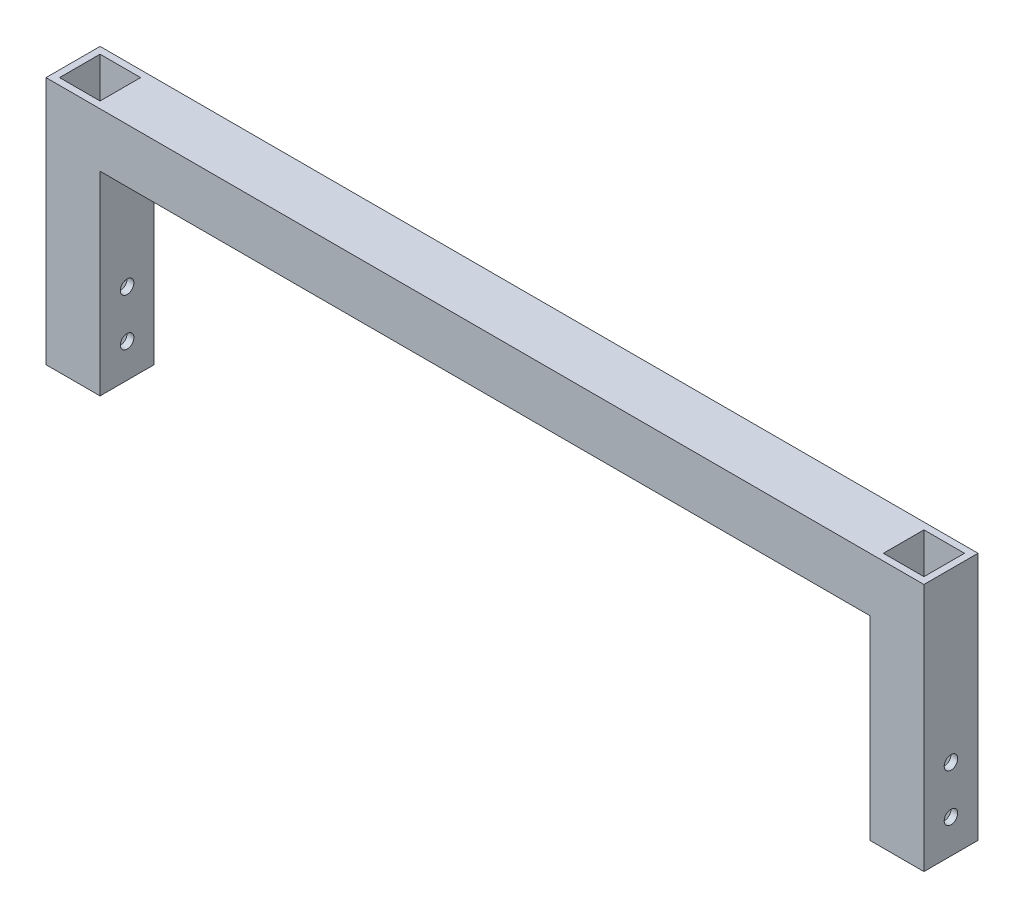
ISO-10303-21;
HEADER;
FILE_DESCRIPTION(('STEP AP214'),'2;1');
FILE_NAME('part.step','',(''),(''),'','','');
FILE_SCHEMA(('AUTOMOTIVE_DESIGN { 1 0 10303 214 1 1 1 1 }'));
ENDSEC;
DATA;
#1=APPLICATION_CONTEXT('core data for automotive mechanical design processes');
#2=APPLICATION_PROTOCOL_DEFINITION('international standard','automotive_design',2000,#1);
#3=PRODUCT_CONTEXT('',#1,'mechanical');
#4=PRODUCT('Part','Part','',(#3));
#5=PRODUCT_RELATED_PRODUCT_CATEGORY('part','',(#4));
#6=PRODUCT_DEFINITION_FORMATION('','',#4);
#7=PRODUCT_DEFINITION_CONTEXT('part definition',#1,'design');
#8=PRODUCT_DEFINITION('design','',#6,#7);
#9=PRODUCT_DEFINITION_SHAPE('','',#8);
#10=(LENGTH_UNIT() NAMED_UNIT(*) SI_UNIT(.MILLI.,.METRE.));
#11=(NAMED_UNIT(*) PLANE_ANGLE_UNIT() SI_UNIT($,.RADIAN.));
#12=(NAMED_UNIT(*) SI_UNIT($,.STERADIAN.) SOLID_ANGLE_UNIT());
#13=UNCERTAINTY_MEASURE_WITH_UNIT(LENGTH_MEASURE(1.E-05),#10,'distance_accuracy_value','');
#14=(GEOMETRIC_REPRESENTATION_CONTEXT(3) GLOBAL_UNCERTAINTY_ASSIGNED_CONTEXT((#13)) GLOBAL_UNIT_ASSIGNED_CONTEXT((#10,
#11,#12)) REPRESENTATION_CONTEXT('',''));
#15=CARTESIAN_POINT('',(0.,0.,0.));
#16=DIRECTION('',(0.,0.,1.));
#17=DIRECTION('',(1.,0.,0.));
#18=AXIS2_PLACEMENT_3D('',#15,#16,#17);
#19=CARTESIAN_POINT('',(22.225,116.84,3.175));
#20=DIRECTION('',(-1.,0.,0.));
#21=DIRECTION('',(0.,0.,1.));
#22=AXIS2_PLACEMENT_3D('',#19,#20,#21);
#23=PLANE('',#22);
#24=CARTESIAN_POINT('',(22.225,38.1,-9.525));
#25=DIRECTION('',(-1.,0.,0.));
#26=DIRECTION('',(0.,0.,1.));
#27=AXIS2_PLACEMENT_3D('',#24,#25,#26);
#28=CIRCLE('',#27,3.175);
#29=CARTESIAN_POINT('',(22.225,38.1,-6.35));
#30=VERTEX_POINT('',#29);
#31=EDGE_CURVE('E281',#30,#30,#28,.T.);
#32=ORIENTED_EDGE('',*,*,#31,.T.);
#33=EDGE_LOOP('',(#32));
#34=FACE_BOUND('',#33,.T.);
#35=CARTESIAN_POINT('',(22.225,15.875,-9.525));
#36=DIRECTION('',(-1.,0.,0.));
#37=DIRECTION('',(0.,0.,1.));
#38=AXIS2_PLACEMENT_3D('',#35,#36,#37);
#39=CIRCLE('',#38,3.175);
#40=CARTESIAN_POINT('',(22.225,15.875,-6.35));
#41=VERTEX_POINT('',#40);
#42=EDGE_CURVE('E309',#41,#41,#39,.T.);
#43=ORIENTED_EDGE('',*,*,#42,.T.);
#44=EDGE_LOOP('',(#43));
#45=FACE_BOUND('',#44,.T.);
#46=DIRECTION('',(0.,0.,-1.));
#47=VECTOR('',#46,1.);
#48=CARTESIAN_POINT('',(22.225,91.44,3.175));
#49=LINE('',#48,#47);
#50=CARTESIAN_POINT('',(22.225,91.44,3.175));
#51=VERTEX_POINT('',#50);
#52=CARTESIAN_POINT('',(22.225,91.44,-22.225));
#53=VERTEX_POINT('',#52);
#54=EDGE_CURVE('E61',#51,#53,#49,.T.);
#55=ORIENTED_EDGE('',*,*,#54,.F.);
#56=DIRECTION('',(0.,-1.,0.));
#57=VECTOR('',#56,1.);
#58=CARTESIAN_POINT('',(22.225,116.84,3.175));
#59=LINE('',#58,#57);
#60=CARTESIAN_POINT('',(22.225,0.,3.175));
#61=VERTEX_POINT('',#60);
#62=EDGE_CURVE('E45',#51,#61,#59,.T.);
#63=ORIENTED_EDGE('',*,*,#62,.T.);
#64=DIRECTION('',(0.,0.,-1.));
#65=VECTOR('',#64,1.);
#66=CARTESIAN_POINT('',(22.225,0.,3.175));
#67=LINE('',#66,#65);
#68=CARTESIAN_POINT('',(22.225,0.,-22.225));
#69=VERTEX_POINT('',#68);
#70=EDGE_CURVE('E364',#61,#69,#67,.T.);
#71=ORIENTED_EDGE('',*,*,#70,.T.);
#72=DIRECTION('',(0.,-1.,0.));
#73=VECTOR('',#72,1.);
#74=CARTESIAN_POINT('',(22.225,116.84,-22.225));
#75=LINE('',#74,#73);
#76=EDGE_CURVE('E370',#53,#69,#75,.T.);
#77=ORIENTED_EDGE('',*,*,#76,.F.);
#78=EDGE_LOOP('',(#55,#63,#71,#77));
#79=FACE_BOUND('',#78,.T.);
#80=ADVANCED_FACE('F34',(#34,#45,#79),#23,.F.);
#81=CARTESIAN_POINT('',(0.,116.84,0.));
#82=DIRECTION('',(0.,-1.,0.));
#83=DIRECTION('',(0.,0.,-1.));
#84=AXIS2_PLACEMENT_3D('',#81,#82,#83);
#85=PLANE('',#84);
#86=DIRECTION('',(0.,0.,1.));
#87=VECTOR('',#86,1.);
#88=CARTESIAN_POINT('',(-3.175,116.84,3.175));
#89=LINE('',#88,#87);
#90=CARTESIAN_POINT('',(-3.175,116.84,-22.225));
#91=VERTEX_POINT('',#90);
#92=CARTESIAN_POINT('',(-3.175,116.84,3.175));
#93=VERTEX_POINT('',#92);
#94=EDGE_CURVE('E350',#91,#93,#89,.T.);
#95=ORIENTED_EDGE('',*,*,#94,.T.);
#96=DIRECTION('',(1.,0.,0.));
#97=VECTOR('',#96,1.);
#98=CARTESIAN_POINT('',(-3.175,116.84,3.175));
#99=LINE('',#98,#97);
#100=CARTESIAN_POINT('',(409.321,116.84,3.175));
#101=VERTEX_POINT('',#100);
#102=EDGE_CURVE('E353',#93,#101,#99,.T.);
#103=ORIENTED_EDGE('',*,*,#102,.T.);
#104=DIRECTION('',(0.,0.,1.));
#105=VECTOR('',#104,1.);
#106=CARTESIAN_POINT('',(409.321,116.84,3.175));
#107=LINE('',#106,#105);
#108=CARTESIAN_POINT('',(409.321,116.84,-22.225));
#109=VERTEX_POINT('',#108);
#110=EDGE_CURVE('E221',#109,#101,#107,.T.);
#111=ORIENTED_EDGE('',*,*,#110,.F.);
#112=DIRECTION('',(-1.,0.,0.));
#113=VECTOR('',#112,1.);
#114=CARTESIAN_POINT('',(-3.175,116.84,-22.225));
#115=LINE('',#114,#113);
#116=EDGE_CURVE('E356',#109,#91,#115,.T.);
#117=ORIENTED_EDGE('',*,*,#116,.T.);
#118=EDGE_LOOP('',(#95,#103,#111,#117));
#119=FACE_BOUND('',#118,.T.);
#120=DIRECTION('',(0.,0.,1.));
#121=VECTOR('',#120,1.);
#122=CARTESIAN_POINT('',(0.,116.84,0.));
#123=LINE('',#122,#121);
#124=CARTESIAN_POINT('',(0.,116.84,-19.05));
#125=VERTEX_POINT('',#124);
#126=CARTESIAN_POINT('',(0.,116.84,0.));
#127=VERTEX_POINT('',#126);
#128=EDGE_CURVE('E319',#125,#127,#123,.T.);
#129=ORIENTED_EDGE('',*,*,#128,.F.);
#130=DIRECTION('',(-1.,0.,0.));
#131=VECTOR('',#130,1.);
#132=CARTESIAN_POINT('',(0.,116.84,-19.05));
#133=LINE('',#132,#131);
#134=CARTESIAN_POINT('',(19.05,116.84,-19.05));
#135=VERTEX_POINT('',#134);
#136=EDGE_CURVE('E327',#135,#125,#133,.T.);
#137=ORIENTED_EDGE('',*,*,#136,.F.);
#138=DIRECTION('',(0.,0.,-1.));
#139=VECTOR('',#138,1.);
#140=CARTESIAN_POINT('',(19.05,116.84,0.));
#141=LINE('',#140,#139);
#142=CARTESIAN_POINT('',(19.05,116.84,0.));
#143=VERTEX_POINT('',#142);
#144=EDGE_CURVE('E324',#143,#135,#141,.T.);
#145=ORIENTED_EDGE('',*,*,#144,.F.);
#146=DIRECTION('',(1.,0.,0.));
#147=VECTOR('',#146,1.);
#148=CARTESIAN_POINT('',(0.,116.84,0.));
#149=LINE('',#148,#147);
#150=EDGE_CURVE('E321',#127,#143,#149,.T.);
#151=ORIENTED_EDGE('',*,*,#150,.F.);
#152=EDGE_LOOP('',(#129,#137,#145,#151));
#153=FACE_BOUND('',#152,.T.);
#154=DIRECTION('',(1.,0.,0.));
#155=VECTOR('',#154,1.);
#156=CARTESIAN_POINT('',(406.146,116.84,-19.05));
#157=LINE('',#156,#155);
#158=CARTESIAN_POINT('',(387.096,116.84,-19.05));
#159=VERTEX_POINT('',#158);
#160=CARTESIAN_POINT('',(406.146,116.84,-19.05));
#161=VERTEX_POINT('',#160);
#162=EDGE_CURVE('E181',#159,#161,#157,.T.);
#163=ORIENTED_EDGE('',*,*,#162,.T.);
#164=DIRECTION('',(0.,0.,1.));
#165=VECTOR('',#164,1.);
#166=CARTESIAN_POINT('',(406.146,116.84,0.));
#167=LINE('',#166,#165);
#168=CARTESIAN_POINT('',(406.146,116.84,0.));
#169=VERTEX_POINT('',#168);
#170=EDGE_CURVE('E191',#161,#169,#167,.T.);
#171=ORIENTED_EDGE('',*,*,#170,.T.);
#172=DIRECTION('',(-1.,0.,0.));
#173=VECTOR('',#172,1.);
#174=CARTESIAN_POINT('',(406.146,116.84,0.));
#175=LINE('',#174,#173);
#176=CARTESIAN_POINT('',(387.096,116.84,0.));
#177=VERTEX_POINT('',#176);
#178=EDGE_CURVE('E203',#169,#177,#175,.T.);
#179=ORIENTED_EDGE('',*,*,#178,.T.);
#180=DIRECTION('',(0.,0.,-1.));
#181=VECTOR('',#180,1.);
#182=CARTESIAN_POINT('',(387.096,116.84,0.));
#183=LINE('',#182,#181);
#184=EDGE_CURVE('E201',#177,#159,#183,.T.);
#185=ORIENTED_EDGE('',*,*,#184,.T.);
#186=EDGE_LOOP('',(#163,#171,#179,#185));
#187=FACE_BOUND('',#186,.T.);
#188=ADVANCED_FACE('F200',(#119,#153,#187),#85,.F.);
#189=CARTESIAN_POINT('',(0.,0.,0.));
#190=DIRECTION('',(0.,-1.,0.));
#191=DIRECTION('',(0.,0.,-1.));
#192=AXIS2_PLACEMENT_3D('',#189,#190,#191);
#193=PLANE('',#192);
#194=DIRECTION('',(0.,0.,1.));
#195=VECTOR('',#194,1.);
#196=CARTESIAN_POINT('',(-3.175,0.,3.175));
#197=LINE('',#196,#195);
#198=CARTESIAN_POINT('',(-3.175,0.,-22.225));
#199=VERTEX_POINT('',#198);
#200=CARTESIAN_POINT('',(-3.175,0.,3.175));
#201=VERTEX_POINT('',#200);
#202=EDGE_CURVE('E349',#199,#201,#197,.T.);
#203=ORIENTED_EDGE('',*,*,#202,.F.);
#204=DIRECTION('',(-1.,0.,0.));
#205=VECTOR('',#204,1.);
#206=CARTESIAN_POINT('',(-3.175,0.,-22.225));
#207=LINE('',#206,#205);
#208=EDGE_CURVE('E354',#69,#199,#207,.T.);
#209=ORIENTED_EDGE('',*,*,#208,.F.);
#210=ORIENTED_EDGE('',*,*,#70,.F.);
#211=DIRECTION('',(1.,0.,0.));
#212=VECTOR('',#211,1.);
#213=CARTESIAN_POINT('',(-3.175,0.,3.175));
#214=LINE('',#213,#212);
#215=EDGE_CURVE('E361',#201,#61,#214,.T.);
#216=ORIENTED_EDGE('',*,*,#215,.F.);
#217=EDGE_LOOP('',(#203,#209,#210,#216));
#218=FACE_BOUND('',#217,.T.);
#219=DIRECTION('',(-1.,0.,0.));
#220=VECTOR('',#219,1.);
#221=CARTESIAN_POINT('',(0.,0.,-19.05));
#222=LINE('',#221,#220);
#223=CARTESIAN_POINT('',(19.05,0.,-19.05));
#224=VERTEX_POINT('',#223);
#225=CARTESIAN_POINT('',(0.,0.,-19.05));
#226=VERTEX_POINT('',#225);
#227=EDGE_CURVE('E322',#224,#226,#222,.T.);
#228=ORIENTED_EDGE('',*,*,#227,.T.);
#229=DIRECTION('',(0.,0.,1.));
#230=VECTOR('',#229,1.);
#231=CARTESIAN_POINT('',(0.,0.,0.));
#232=LINE('',#231,#230);
#233=CARTESIAN_POINT('',(0.,0.,0.));
#234=VERTEX_POINT('',#233);
#235=EDGE_CURVE('E318',#226,#234,#232,.T.);
#236=ORIENTED_EDGE('',*,*,#235,.T.);
#237=DIRECTION('',(1.,0.,0.));
#238=VECTOR('',#237,1.);
#239=CARTESIAN_POINT('',(0.,0.,0.));
#240=LINE('',#239,#238);
#241=CARTESIAN_POINT('',(19.05,0.,0.));
#242=VERTEX_POINT('',#241);
#243=EDGE_CURVE('E332',#234,#242,#240,.T.);
#244=ORIENTED_EDGE('',*,*,#243,.T.);
#245=DIRECTION('',(0.,0.,-1.));
#246=VECTOR('',#245,1.);
#247=CARTESIAN_POINT('',(19.05,0.,0.));
#248=LINE('',#247,#246);
#249=EDGE_CURVE('E335',#242,#224,#248,.T.);
#250=ORIENTED_EDGE('',*,*,#249,.T.);
#251=EDGE_LOOP('',(#228,#236,#244,#250));
#252=FACE_BOUND('',#251,.T.);
#253=ADVANCED_FACE('F394',(#218,#252),#193,.T.);
#254=CARTESIAN_POINT('',(-3.175,116.84,3.175));
#255=DIRECTION('',(1.,0.,0.));
#256=DIRECTION('',(0.,0.,-1.));
#257=AXIS2_PLACEMENT_3D('',#254,#255,#256);
#258=PLANE('',#257);
#259=CARTESIAN_POINT('',(-3.175,38.1,-9.525));
#260=DIRECTION('',(-1.,0.,0.));
#261=DIRECTION('',(0.,0.,1.));
#262=AXIS2_PLACEMENT_3D('',#259,#260,#261);
#263=CIRCLE('',#262,3.175);
#264=CARTESIAN_POINT('',(-3.175,38.1,-6.35));
#265=VERTEX_POINT('',#264);
#266=EDGE_CURVE('E295',#265,#265,#263,.T.);
#267=ORIENTED_EDGE('',*,*,#266,.F.);
#268=EDGE_LOOP('',(#267));
#269=FACE_BOUND('',#268,.T.);
#270=CARTESIAN_POINT('',(-3.175,15.875,-9.525));
#271=DIRECTION('',(-1.,0.,0.));
#272=DIRECTION('',(0.,0.,1.));
#273=AXIS2_PLACEMENT_3D('',#270,#271,#272);
#274=CIRCLE('',#273,3.175);
#275=CARTESIAN_POINT('',(-3.175,15.875,-6.35));
#276=VERTEX_POINT('',#275);
#277=EDGE_CURVE('E308',#276,#276,#274,.T.);
#278=ORIENTED_EDGE('',*,*,#277,.F.);
#279=EDGE_LOOP('',(#278));
#280=FACE_BOUND('',#279,.T.);
#281=ORIENTED_EDGE('',*,*,#202,.T.);
#282=DIRECTION('',(0.,-1.,0.));
#283=VECTOR('',#282,1.);
#284=CARTESIAN_POINT('',(-3.175,116.84,3.175));
#285=LINE('',#284,#283);
#286=EDGE_CURVE('E11',#93,#201,#285,.T.);
#287=ORIENTED_EDGE('',*,*,#286,.F.);
#288=ORIENTED_EDGE('',*,*,#94,.F.);
#289=DIRECTION('',(0.,-1.,0.));
#290=VECTOR('',#289,1.);
#291=CARTESIAN_POINT('',(-3.175,116.84,-22.225));
#292=LINE('',#291,#290);
#293=EDGE_CURVE('E358',#91,#199,#292,.T.);
#294=ORIENTED_EDGE('',*,*,#293,.T.);
#295=EDGE_LOOP('',(#281,#287,#288,#294));
#296=FACE_BOUND('',#295,.T.);
#297=ADVANCED_FACE('F36',(#269,#280,#296),#258,.F.);
#298=CARTESIAN_POINT('',(-3.175,116.84,3.175));
#299=DIRECTION('',(0.,0.,-1.));
#300=DIRECTION('',(-1.,0.,0.));
#301=AXIS2_PLACEMENT_3D('',#298,#299,#300);
#302=PLANE('',#301);
#303=ORIENTED_EDGE('',*,*,#215,.T.);
#304=ORIENTED_EDGE('',*,*,#62,.F.);
#305=DIRECTION('',(-1.,0.,0.));
#306=VECTOR('',#305,1.);
#307=CARTESIAN_POINT('',(203.073,91.44,3.175));
#308=LINE('',#307,#306);
#309=CARTESIAN_POINT('',(383.921,91.44,3.175));
#310=VERTEX_POINT('',#309);
#311=EDGE_CURVE('E291',#310,#51,#308,.T.);
#312=ORIENTED_EDGE('',*,*,#311,.F.);
#313=DIRECTION('',(0.,-1.,0.));
#314=VECTOR('',#313,1.);
#315=CARTESIAN_POINT('',(383.921,116.84,3.175));
#316=LINE('',#315,#314);
#317=CARTESIAN_POINT('',(383.921,0.,3.175));
#318=VERTEX_POINT('',#317);
#319=EDGE_CURVE('E237',#310,#318,#316,.T.);
#320=ORIENTED_EDGE('',*,*,#319,.T.);
#321=DIRECTION('',(-1.,0.,0.));
#322=VECTOR('',#321,1.);
#323=CARTESIAN_POINT('',(409.321,0.,3.175));
#324=LINE('',#323,#322);
#325=CARTESIAN_POINT('',(409.321,0.,3.175));
#326=VERTEX_POINT('',#325);
#327=EDGE_CURVE('E225',#326,#318,#324,.T.);
#328=ORIENTED_EDGE('',*,*,#327,.F.);
#329=DIRECTION('',(0.,-1.,0.));
#330=VECTOR('',#329,1.);
#331=CARTESIAN_POINT('',(409.321,116.84,3.175));
#332=LINE('',#331,#330);
#333=EDGE_CURVE('E224',#101,#326,#332,.T.);
#334=ORIENTED_EDGE('',*,*,#333,.F.);
#335=ORIENTED_EDGE('',*,*,#102,.F.);
#336=ORIENTED_EDGE('',*,*,#286,.T.);
#337=EDGE_LOOP('',(#303,#304,#312,#320,#328,#334,#335,#336));
#338=FACE_BOUND('',#337,.T.);
#339=ADVANCED_FACE('F480',(#338),#302,.F.);
#340=CARTESIAN_POINT('',(-3.175,116.84,-22.225));
#341=DIRECTION('',(0.,0.,1.));
#342=DIRECTION('',(1.,0.,0.));
#343=AXIS2_PLACEMENT_3D('',#340,#341,#342);
#344=PLANE('',#343);
#345=ORIENTED_EDGE('',*,*,#208,.T.);
#346=ORIENTED_EDGE('',*,*,#293,.F.);
#347=ORIENTED_EDGE('',*,*,#116,.F.);
#348=DIRECTION('',(0.,-1.,0.));
#349=VECTOR('',#348,1.);
#350=CARTESIAN_POINT('',(409.321,116.84,-22.225));
#351=LINE('',#350,#349);
#352=CARTESIAN_POINT('',(409.321,0.,-22.225));
#353=VERTEX_POINT('',#352);
#354=EDGE_CURVE('E245',#109,#353,#351,.T.);
#355=ORIENTED_EDGE('',*,*,#354,.T.);
#356=DIRECTION('',(1.,0.,0.));
#357=VECTOR('',#356,1.);
#358=CARTESIAN_POINT('',(409.321,0.,-22.225));
#359=LINE('',#358,#357);
#360=CARTESIAN_POINT('',(383.921,0.,-22.225));
#361=VERTEX_POINT('',#360);
#362=EDGE_CURVE('E228',#361,#353,#359,.T.);
#363=ORIENTED_EDGE('',*,*,#362,.F.);
#364=DIRECTION('',(0.,-1.,0.));
#365=VECTOR('',#364,1.);
#366=CARTESIAN_POINT('',(383.921,116.84,-22.225));
#367=LINE('',#366,#365);
#368=CARTESIAN_POINT('',(383.921,91.44,-22.225));
#369=VERTEX_POINT('',#368);
#370=EDGE_CURVE('E244',#369,#361,#367,.T.);
#371=ORIENTED_EDGE('',*,*,#370,.F.);
#372=DIRECTION('',(-1.,0.,0.));
#373=VECTOR('',#372,1.);
#374=CARTESIAN_POINT('',(203.073,91.44,-22.225));
#375=LINE('',#374,#373);
#376=EDGE_CURVE('E286',#369,#53,#375,.T.);
#377=ORIENTED_EDGE('',*,*,#376,.T.);
#378=ORIENTED_EDGE('',*,*,#76,.T.);
#379=EDGE_LOOP('',(#345,#346,#347,#355,#363,#371,#377,#378));
#380=FACE_BOUND('',#379,.T.);
#381=ADVANCED_FACE('F495',(#380),#344,.F.);
#382=CARTESIAN_POINT('',(0.,116.84,0.));
#383=DIRECTION('',(1.,0.,0.));
#384=DIRECTION('',(0.,0.,-1.));
#385=AXIS2_PLACEMENT_3D('',#382,#383,#384);
#386=PLANE('',#385);
#387=CARTESIAN_POINT('',(0.,38.1,-9.525));
#388=DIRECTION('',(1.,0.,0.));
#389=DIRECTION('',(0.,0.,-1.));
#390=AXIS2_PLACEMENT_3D('',#387,#388,#389);
#391=CIRCLE('',#390,3.175);
#392=CARTESIAN_POINT('',(0.,38.1,-12.7));
#393=VERTEX_POINT('',#392);
#394=EDGE_CURVE('E305',#393,#393,#391,.T.);
#395=ORIENTED_EDGE('',*,*,#394,.F.);
#396=EDGE_LOOP('',(#395));
#397=FACE_BOUND('',#396,.T.);
#398=CARTESIAN_POINT('',(0.,15.875,-9.525));
#399=DIRECTION('',(1.,0.,0.));
#400=DIRECTION('',(0.,0.,-1.));
#401=AXIS2_PLACEMENT_3D('',#398,#399,#400);
#402=CIRCLE('',#401,3.175);
#403=CARTESIAN_POINT('',(0.,15.875,-12.7));
#404=VERTEX_POINT('',#403);
#405=EDGE_CURVE('E315',#404,#404,#402,.T.);
#406=ORIENTED_EDGE('',*,*,#405,.F.);
#407=EDGE_LOOP('',(#406));
#408=FACE_BOUND('',#407,.T.);
#409=ORIENTED_EDGE('',*,*,#235,.F.);
#410=DIRECTION('',(0.,-1.,0.));
#411=VECTOR('',#410,1.);
#412=CARTESIAN_POINT('',(0.,116.84,-19.05));
#413=LINE('',#412,#411);
#414=EDGE_CURVE('E329',#125,#226,#413,.T.);
#415=ORIENTED_EDGE('',*,*,#414,.F.);
#416=ORIENTED_EDGE('',*,*,#128,.T.);
#417=DIRECTION('',(0.,-1.,0.));
#418=VECTOR('',#417,1.);
#419=CARTESIAN_POINT('',(0.,116.84,0.));
#420=LINE('',#419,#418);
#421=EDGE_CURVE('E346',#127,#234,#420,.T.);
#422=ORIENTED_EDGE('',*,*,#421,.T.);
#423=EDGE_LOOP('',(#409,#415,#416,#422));
#424=FACE_BOUND('',#423,.T.);
#425=ADVANCED_FACE('F399',(#397,#408,#424),#386,.T.);
#426=CARTESIAN_POINT('',(0.,116.84,0.));
#427=DIRECTION('',(0.,0.,-1.));
#428=DIRECTION('',(-1.,0.,0.));
#429=AXIS2_PLACEMENT_3D('',#426,#427,#428);
#430=PLANE('',#429);
#431=ORIENTED_EDGE('',*,*,#243,.F.);
#432=ORIENTED_EDGE('',*,*,#421,.F.);
#433=ORIENTED_EDGE('',*,*,#150,.T.);
#434=DIRECTION('',(0.,-1.,0.));
#435=VECTOR('',#434,1.);
#436=CARTESIAN_POINT('',(19.05,116.84,0.));
#437=LINE('',#436,#435);
#438=EDGE_CURVE('E344',#143,#242,#437,.T.);
#439=ORIENTED_EDGE('',*,*,#438,.T.);
#440=EDGE_LOOP('',(#431,#432,#433,#439));
#441=FACE_BOUND('',#440,.T.);
#442=ADVANCED_FACE('F386',(#441),#430,.T.);
#443=CARTESIAN_POINT('',(19.05,116.84,0.));
#444=DIRECTION('',(-1.,0.,0.));
#445=DIRECTION('',(0.,0.,1.));
#446=AXIS2_PLACEMENT_3D('',#443,#444,#445);
#447=PLANE('',#446);
#448=CARTESIAN_POINT('',(19.05,38.1,-9.525));
#449=DIRECTION('',(-1.,0.,0.));
#450=DIRECTION('',(0.,0.,1.));
#451=AXIS2_PLACEMENT_3D('',#448,#449,#450);
#452=CIRCLE('',#451,3.175);
#453=CARTESIAN_POINT('',(19.05,38.1,-6.35));
#454=VERTEX_POINT('',#453);
#455=EDGE_CURVE('E303',#454,#454,#452,.T.);
#456=ORIENTED_EDGE('',*,*,#455,.F.);
#457=EDGE_LOOP('',(#456));
#458=FACE_BOUND('',#457,.T.);
#459=CARTESIAN_POINT('',(19.05,15.875,-9.525));
#460=DIRECTION('',(-1.,0.,0.));
#461=DIRECTION('',(0.,0.,1.));
#462=AXIS2_PLACEMENT_3D('',#459,#460,#461);
#463=CIRCLE('',#462,3.175);
#464=CARTESIAN_POINT('',(19.05,15.875,-6.35));
#465=VERTEX_POINT('',#464);
#466=EDGE_CURVE('E312',#465,#465,#463,.T.);
#467=ORIENTED_EDGE('',*,*,#466,.F.);
#468=EDGE_LOOP('',(#467));
#469=FACE_BOUND('',#468,.T.);
#470=ORIENTED_EDGE('',*,*,#249,.F.);
#471=ORIENTED_EDGE('',*,*,#438,.F.);
#472=ORIENTED_EDGE('',*,*,#144,.T.);
#473=DIRECTION('',(0.,-1.,0.));
#474=VECTOR('',#473,1.);
#475=CARTESIAN_POINT('',(19.05,116.84,-19.05));
#476=LINE('',#475,#474);
#477=EDGE_CURVE('E342',#135,#224,#476,.T.);
#478=ORIENTED_EDGE('',*,*,#477,.T.);
#479=EDGE_LOOP('',(#470,#471,#472,#478));
#480=FACE_BOUND('',#479,.T.);
#481=ADVANCED_FACE('F382',(#458,#469,#480),#447,.T.);
#482=CARTESIAN_POINT('',(0.,116.84,-19.05));
#483=DIRECTION('',(0.,0.,1.));
#484=DIRECTION('',(1.,0.,0.));
#485=AXIS2_PLACEMENT_3D('',#482,#483,#484);
#486=PLANE('',#485);
#487=ORIENTED_EDGE('',*,*,#227,.F.);
#488=ORIENTED_EDGE('',*,*,#477,.F.);
#489=ORIENTED_EDGE('',*,*,#136,.T.);
#490=ORIENTED_EDGE('',*,*,#414,.T.);
#491=EDGE_LOOP('',(#487,#488,#489,#490));
#492=FACE_BOUND('',#491,.T.);
#493=ADVANCED_FACE('F385',(#492),#486,.T.);
#494=CARTESIAN_POINT('',(22.225,15.875,-9.525));
#495=DIRECTION('',(-1.,0.,0.));
#496=DIRECTION('',(0.,0.,1.));
#497=AXIS2_PLACEMENT_3D('',#494,#495,#496);
#498=CYLINDRICAL_SURFACE('',#497,3.175);
#499=ORIENTED_EDGE('',*,*,#466,.T.);
#500=EDGE_LOOP('',(#499));
#501=FACE_BOUND('',#500,.T.);
#502=ORIENTED_EDGE('',*,*,#42,.F.);
#503=EDGE_LOOP('',(#502));
#504=FACE_BOUND('',#503,.T.);
#505=ADVANCED_FACE('F379',(#501,#504),#498,.F.);
#506=ORIENTED_EDGE('',*,*,#405,.T.);
#507=EDGE_LOOP('',(#506));
#508=FACE_BOUND('',#507,.T.);
#509=ORIENTED_EDGE('',*,*,#277,.T.);
#510=EDGE_LOOP('',(#509));
#511=FACE_BOUND('',#510,.T.);
#512=ADVANCED_FACE('F410',(#508,#511),#498,.F.);
#513=CARTESIAN_POINT('',(22.225,38.1,-9.525));
#514=DIRECTION('',(-1.,0.,0.));
#515=DIRECTION('',(0.,0.,1.));
#516=AXIS2_PLACEMENT_3D('',#513,#514,#515);
#517=CYLINDRICAL_SURFACE('',#516,3.175);
#518=ORIENTED_EDGE('',*,*,#455,.T.);
#519=EDGE_LOOP('',(#518));
#520=FACE_BOUND('',#519,.T.);
#521=ORIENTED_EDGE('',*,*,#31,.F.);
#522=EDGE_LOOP('',(#521));
#523=FACE_BOUND('',#522,.T.);
#524=ADVANCED_FACE('F460',(#520,#523),#517,.F.);
#525=ORIENTED_EDGE('',*,*,#394,.T.);
#526=EDGE_LOOP('',(#525));
#527=FACE_BOUND('',#526,.T.);
#528=ORIENTED_EDGE('',*,*,#266,.T.);
#529=EDGE_LOOP('',(#528));
#530=FACE_BOUND('',#529,.T.);
#531=ADVANCED_FACE('F459',(#527,#530),#517,.F.);
#532=CARTESIAN_POINT('',(203.073,91.44,3.175));
#533=DIRECTION('',(0.,1.,0.));
#534=DIRECTION('',(0.,0.,1.));
#535=AXIS2_PLACEMENT_3D('',#532,#533,#534);
#536=PLANE('',#535);
#537=ORIENTED_EDGE('',*,*,#54,.T.);
#538=ORIENTED_EDGE('',*,*,#376,.F.);
#539=DIRECTION('',(0.,0.,-1.));
#540=VECTOR('',#539,1.);
#541=CARTESIAN_POINT('',(383.921,91.44,3.175));
#542=LINE('',#541,#540);
#543=EDGE_CURVE('E38',#310,#369,#542,.T.);
#544=ORIENTED_EDGE('',*,*,#543,.F.);
#545=ORIENTED_EDGE('',*,*,#311,.T.);
#546=EDGE_LOOP('',(#537,#538,#544,#545));
#547=FACE_BOUND('',#546,.T.);
#548=ADVANCED_FACE('F455',(#547),#536,.F.);
#549=CARTESIAN_POINT('',(406.146,116.84,0.));
#550=DIRECTION('',(0.,0.,1.));
#551=DIRECTION('',(1.,0.,0.));
#552=AXIS2_PLACEMENT_3D('',#549,#550,#551);
#553=PLANE('',#552);
#554=DIRECTION('',(-1.,0.,0.));
#555=VECTOR('',#554,1.);
#556=CARTESIAN_POINT('',(406.146,0.,0.));
#557=LINE('',#556,#555);
#558=CARTESIAN_POINT('',(406.146,0.,0.));
#559=VERTEX_POINT('',#558);
#560=CARTESIAN_POINT('',(387.096,0.,0.));
#561=VERTEX_POINT('',#560);
#562=EDGE_CURVE('E198',#559,#561,#557,.T.);
#563=ORIENTED_EDGE('',*,*,#562,.T.);
#564=DIRECTION('',(0.,-1.,0.));
#565=VECTOR('',#564,1.);
#566=CARTESIAN_POINT('',(387.096,116.84,0.));
#567=LINE('',#566,#565);
#568=EDGE_CURVE('E218',#177,#561,#567,.T.);
#569=ORIENTED_EDGE('',*,*,#568,.F.);
#570=ORIENTED_EDGE('',*,*,#178,.F.);
#571=DIRECTION('',(0.,-1.,0.));
#572=VECTOR('',#571,1.);
#573=CARTESIAN_POINT('',(406.146,116.84,0.));
#574=LINE('',#573,#572);
#575=EDGE_CURVE('E194',#169,#559,#574,.T.);
#576=ORIENTED_EDGE('',*,*,#575,.T.);
#577=EDGE_LOOP('',(#563,#569,#570,#576));
#578=FACE_BOUND('',#577,.T.);
#579=ADVANCED_FACE('F458',(#578),#553,.F.);
#580=CARTESIAN_POINT('',(387.096,116.84,0.));
#581=DIRECTION('',(-1.,0.,0.));
#582=DIRECTION('',(0.,0.,1.));
#583=AXIS2_PLACEMENT_3D('',#580,#581,#582);
#584=PLANE('',#583);
#585=CARTESIAN_POINT('',(387.096,38.1,-9.525));
#586=DIRECTION('',(-1.,0.,0.));
#587=DIRECTION('',(0.,0.,1.));
#588=AXIS2_PLACEMENT_3D('',#585,#586,#587);
#589=CIRCLE('',#588,3.175);
#590=CARTESIAN_POINT('',(387.096,38.1,-6.35));
#591=VERTEX_POINT('',#590);
#592=EDGE_CURVE('E787',#591,#591,#589,.F.);
#593=ORIENTED_EDGE('',*,*,#592,.F.);
#594=EDGE_LOOP('',(#593));
#595=FACE_BOUND('',#594,.T.);
#596=CARTESIAN_POINT('',(387.096,15.875,-9.525));
#597=DIRECTION('',(-1.,0.,0.));
#598=DIRECTION('',(0.,0.,1.));
#599=AXIS2_PLACEMENT_3D('',#596,#597,#598);
#600=CIRCLE('',#599,3.175);
#601=CARTESIAN_POINT('',(387.096,15.875,-6.35));
#602=VERTEX_POINT('',#601);
#603=EDGE_CURVE('E210',#602,#602,#600,.F.);
#604=ORIENTED_EDGE('',*,*,#603,.F.);
#605=EDGE_LOOP('',(#604));
#606=FACE_BOUND('',#605,.T.);
#607=DIRECTION('',(0.,0.,-1.));
#608=VECTOR('',#607,1.);
#609=CARTESIAN_POINT('',(387.096,0.,0.));
#610=LINE('',#609,#608);
#611=CARTESIAN_POINT('',(387.096,0.,-19.05));
#612=VERTEX_POINT('',#611);
#613=EDGE_CURVE('E212',#561,#612,#610,.T.);
#614=ORIENTED_EDGE('',*,*,#613,.T.);
#615=DIRECTION('',(0.,-1.,0.));
#616=VECTOR('',#615,1.);
#617=CARTESIAN_POINT('',(387.096,116.84,-19.05));
#618=LINE('',#617,#616);
#619=EDGE_CURVE('E188',#159,#612,#618,.T.);
#620=ORIENTED_EDGE('',*,*,#619,.F.);
#621=ORIENTED_EDGE('',*,*,#184,.F.);
#622=ORIENTED_EDGE('',*,*,#568,.T.);
#623=EDGE_LOOP('',(#614,#620,#621,#622));
#624=FACE_BOUND('',#623,.T.);
#625=ADVANCED_FACE('F640',(#595,#606,#624),#584,.F.);
#626=CARTESIAN_POINT('',(406.146,116.84,-19.05));
#627=DIRECTION('',(0.,0.,-1.));
#628=DIRECTION('',(-1.,0.,0.));
#629=AXIS2_PLACEMENT_3D('',#626,#627,#628);
#630=PLANE('',#629);
#631=DIRECTION('',(1.,0.,0.));
#632=VECTOR('',#631,1.);
#633=CARTESIAN_POINT('',(406.146,0.,-19.05));
#634=LINE('',#633,#632);
#635=CARTESIAN_POINT('',(406.146,0.,-19.05));
#636=VERTEX_POINT('',#635);
#637=EDGE_CURVE('E184',#612,#636,#634,.T.);
#638=ORIENTED_EDGE('',*,*,#637,.T.);
#639=DIRECTION('',(0.,-1.,0.));
#640=VECTOR('',#639,1.);
#641=CARTESIAN_POINT('',(406.146,116.84,-19.05));
#642=LINE('',#641,#640);
#643=EDGE_CURVE('E177',#161,#636,#642,.T.);
#644=ORIENTED_EDGE('',*,*,#643,.F.);
#645=ORIENTED_EDGE('',*,*,#162,.F.);
#646=ORIENTED_EDGE('',*,*,#619,.T.);
#647=EDGE_LOOP('',(#638,#644,#645,#646));
#648=FACE_BOUND('',#647,.T.);
#649=ADVANCED_FACE('F179',(#648),#630,.F.);
#650=CARTESIAN_POINT('',(406.146,116.84,0.));
#651=DIRECTION('',(1.,0.,0.));
#652=DIRECTION('',(0.,0.,-1.));
#653=AXIS2_PLACEMENT_3D('',#650,#651,#652);
#654=PLANE('',#653);
#655=CARTESIAN_POINT('',(406.146,38.1,-9.525));
#656=DIRECTION('',(1.,0.,0.));
#657=DIRECTION('',(0.,0.,-1.));
#658=AXIS2_PLACEMENT_3D('',#655,#656,#657);
#659=CIRCLE('',#658,3.175);
#660=CARTESIAN_POINT('',(406.146,38.1,-12.7));
#661=VERTEX_POINT('',#660);
#662=EDGE_CURVE('E774',#661,#661,#659,.F.);
#663=ORIENTED_EDGE('',*,*,#662,.F.);
#664=EDGE_LOOP('',(#663));
#665=FACE_BOUND('',#664,.T.);
#666=CARTESIAN_POINT('',(406.146,15.875,-9.525));
#667=DIRECTION('',(1.,0.,0.));
#668=DIRECTION('',(0.,0.,-1.));
#669=AXIS2_PLACEMENT_3D('',#666,#667,#668);
#670=CIRCLE('',#669,3.175);
#671=CARTESIAN_POINT('',(406.146,15.875,-12.7));
#672=VERTEX_POINT('',#671);
#673=EDGE_CURVE('E777',#672,#672,#670,.F.);
#674=ORIENTED_EDGE('',*,*,#673,.F.);
#675=EDGE_LOOP('',(#674));
#676=FACE_BOUND('',#675,.T.);
#677=DIRECTION('',(0.,0.,1.));
#678=VECTOR('',#677,1.);
#679=CARTESIAN_POINT('',(406.146,0.,0.));
#680=LINE('',#679,#678);
#681=EDGE_CURVE('E208',#636,#559,#680,.T.);
#682=ORIENTED_EDGE('',*,*,#681,.T.);
#683=ORIENTED_EDGE('',*,*,#575,.F.);
#684=ORIENTED_EDGE('',*,*,#170,.F.);
#685=ORIENTED_EDGE('',*,*,#643,.T.);
#686=EDGE_LOOP('',(#682,#683,#684,#685));
#687=FACE_BOUND('',#686,.T.);
#688=ADVANCED_FACE('F192',(#665,#676,#687),#654,.F.);
#689=CARTESIAN_POINT('',(406.146,0.,0.));
#690=DIRECTION('',(0.,-1.,0.));
#691=DIRECTION('',(0.,0.,-1.));
#692=AXIS2_PLACEMENT_3D('',#689,#690,#691);
#693=PLANE('',#692);
#694=ORIENTED_EDGE('',*,*,#681,.F.);
#695=ORIENTED_EDGE('',*,*,#637,.F.);
#696=ORIENTED_EDGE('',*,*,#613,.F.);
#697=ORIENTED_EDGE('',*,*,#562,.F.);
#698=EDGE_LOOP('',(#694,#695,#696,#697));
#699=FACE_BOUND('',#698,.T.);
#700=DIRECTION('',(0.,0.,1.));
#701=VECTOR('',#700,1.);
#702=CARTESIAN_POINT('',(409.321,0.,3.175));
#703=LINE('',#702,#701);
#704=EDGE_CURVE('E187',#353,#326,#703,.T.);
#705=ORIENTED_EDGE('',*,*,#704,.T.);
#706=ORIENTED_EDGE('',*,*,#327,.T.);
#707=DIRECTION('',(0.,0.,-1.));
#708=VECTOR('',#707,1.);
#709=CARTESIAN_POINT('',(383.921,0.,3.175));
#710=LINE('',#709,#708);
#711=EDGE_CURVE('E231',#318,#361,#710,.T.);
#712=ORIENTED_EDGE('',*,*,#711,.T.);
#713=ORIENTED_EDGE('',*,*,#362,.T.);
#714=EDGE_LOOP('',(#705,#706,#712,#713));
#715=FACE_BOUND('',#714,.T.);
#716=ADVANCED_FACE('F503',(#699,#715),#693,.T.);
#717=CARTESIAN_POINT('',(383.921,116.84,3.175));
#718=DIRECTION('',(-1.,0.,0.));
#719=DIRECTION('',(0.,0.,1.));
#720=AXIS2_PLACEMENT_3D('',#717,#718,#719);
#721=PLANE('',#720);
#722=CARTESIAN_POINT('',(383.921,38.1,-9.525));
#723=DIRECTION('',(-1.,0.,0.));
#724=DIRECTION('',(0.,0.,1.));
#725=AXIS2_PLACEMENT_3D('',#722,#723,#724);
#726=CIRCLE('',#725,3.175);
#727=CARTESIAN_POINT('',(383.921,38.1,-6.35));
#728=VERTEX_POINT('',#727);
#729=EDGE_CURVE('E792',#728,#728,#726,.T.);
#730=ORIENTED_EDGE('',*,*,#729,.F.);
#731=EDGE_LOOP('',(#730));
#732=FACE_BOUND('',#731,.T.);
#733=CARTESIAN_POINT('',(383.921,15.875,-9.525));
#734=DIRECTION('',(-1.,0.,0.));
#735=DIRECTION('',(0.,0.,1.));
#736=AXIS2_PLACEMENT_3D('',#733,#734,#735);
#737=CIRCLE('',#736,3.175);
#738=CARTESIAN_POINT('',(383.921,15.875,-6.35));
#739=VERTEX_POINT('',#738);
#740=EDGE_CURVE('E779',#739,#739,#737,.T.);
#741=ORIENTED_EDGE('',*,*,#740,.F.);
#742=EDGE_LOOP('',(#741));
#743=FACE_BOUND('',#742,.T.);
#744=ORIENTED_EDGE('',*,*,#319,.F.);
#745=ORIENTED_EDGE('',*,*,#543,.T.);
#746=ORIENTED_EDGE('',*,*,#370,.T.);
#747=ORIENTED_EDGE('',*,*,#711,.F.);
#748=EDGE_LOOP('',(#744,#745,#746,#747));
#749=FACE_BOUND('',#748,.T.);
#750=ADVANCED_FACE('F451',(#732,#743,#749),#721,.T.);
#751=CARTESIAN_POINT('',(409.321,116.84,3.175));
#752=DIRECTION('',(1.,0.,0.));
#753=DIRECTION('',(0.,0.,-1.));
#754=AXIS2_PLACEMENT_3D('',#751,#752,#753);
#755=PLANE('',#754);
#756=CARTESIAN_POINT('',(409.321,38.1,-9.525));
#757=DIRECTION('',(-1.,0.,0.));
#758=DIRECTION('',(0.,0.,1.));
#759=AXIS2_PLACEMENT_3D('',#756,#757,#758);
#760=CIRCLE('',#759,3.175);
#761=CARTESIAN_POINT('',(409.321,38.1,-6.35));
#762=VERTEX_POINT('',#761);
#763=EDGE_CURVE('E793',#762,#762,#760,.T.);
#764=ORIENTED_EDGE('',*,*,#763,.T.);
#765=EDGE_LOOP('',(#764));
#766=FACE_BOUND('',#765,.T.);
#767=CARTESIAN_POINT('',(409.321,15.875,-9.525));
#768=DIRECTION('',(-1.,0.,0.));
#769=DIRECTION('',(0.,0.,1.));
#770=AXIS2_PLACEMENT_3D('',#767,#768,#769);
#771=CIRCLE('',#770,3.175);
#772=CARTESIAN_POINT('',(409.321,15.875,-6.35));
#773=VERTEX_POINT('',#772);
#774=EDGE_CURVE('E783',#773,#773,#771,.T.);
#775=ORIENTED_EDGE('',*,*,#774,.T.);
#776=EDGE_LOOP('',(#775));
#777=FACE_BOUND('',#776,.T.);
#778=ORIENTED_EDGE('',*,*,#704,.F.);
#779=ORIENTED_EDGE('',*,*,#354,.F.);
#780=ORIENTED_EDGE('',*,*,#110,.T.);
#781=ORIENTED_EDGE('',*,*,#333,.T.);
#782=EDGE_LOOP('',(#778,#779,#780,#781));
#783=FACE_BOUND('',#782,.T.);
#784=ADVANCED_FACE('F506',(#766,#777,#783),#755,.T.);
#785=CARTESIAN_POINT('',(383.921,15.875,-9.525));
#786=DIRECTION('',(1.,0.,0.));
#787=DIRECTION('',(0.,0.,-1.));
#788=AXIS2_PLACEMENT_3D('',#785,#786,#787);
#789=CYLINDRICAL_SURFACE('',#788,3.175);
#790=ORIENTED_EDGE('',*,*,#774,.F.);
#791=EDGE_LOOP('',(#790));
#792=FACE_BOUND('',#791,.T.);
#793=ORIENTED_EDGE('',*,*,#673,.T.);
#794=EDGE_LOOP('',(#793));
#795=FACE_BOUND('',#794,.T.);
#796=ADVANCED_FACE('F508',(#792,#795),#789,.F.);
#797=ORIENTED_EDGE('',*,*,#740,.T.);
#798=EDGE_LOOP('',(#797));
#799=FACE_BOUND('',#798,.T.);
#800=ORIENTED_EDGE('',*,*,#603,.T.);
#801=EDGE_LOOP('',(#800));
#802=FACE_BOUND('',#801,.T.);
#803=ADVANCED_FACE('F515',(#799,#802),#789,.F.);
#804=CARTESIAN_POINT('',(383.921,38.1,-9.525));
#805=DIRECTION('',(1.,0.,0.));
#806=DIRECTION('',(0.,0.,-1.));
#807=AXIS2_PLACEMENT_3D('',#804,#805,#806);
#808=CYLINDRICAL_SURFACE('',#807,3.175);
#809=ORIENTED_EDGE('',*,*,#763,.F.);
#810=EDGE_LOOP('',(#809));
#811=FACE_BOUND('',#810,.T.);
#812=ORIENTED_EDGE('',*,*,#662,.T.);
#813=EDGE_LOOP('',(#812));
#814=FACE_BOUND('',#813,.T.);
#815=ADVANCED_FACE('F563',(#811,#814),#808,.F.);
#816=ORIENTED_EDGE('',*,*,#729,.T.);
#817=EDGE_LOOP('',(#816));
#818=FACE_BOUND('',#817,.T.);
#819=ORIENTED_EDGE('',*,*,#592,.T.);
#820=EDGE_LOOP('',(#819));
#821=FACE_BOUND('',#820,.T.);
#822=ADVANCED_FACE('F571',(#818,#821),#808,.F.);
#823=CLOSED_SHELL('',(#80,#188,#253,#297,#339,#381,#425,#442,#481,#493,#505,#512,#524,#531,#548,
#579,#625,#649,#688,#716,#750,#784,#796,#803,#815,#822));
#824=DIRECTION('',(0.,0.,-1.));
#825=VECTOR('',#824,1.);
#826=CARTESIAN_POINT('',(22.225,94.615,-19.05));
#827=LINE('',#826,#825);
#828=CARTESIAN_POINT('',(22.225,94.615,0.));
#829=VERTEX_POINT('',#828);
#830=CARTESIAN_POINT('',(22.225,94.615,-19.05));
#831=VERTEX_POINT('',#830);
#832=EDGE_CURVE('E268',#829,#831,#827,.T.);
#833=ORIENTED_EDGE('',*,*,#832,.T.);
#834=DIRECTION('',(0.,1.,0.));
#835=VECTOR('',#834,1.);
#836=CARTESIAN_POINT('',(22.225,94.615,-19.05));
#837=LINE('',#836,#835);
#838=CARTESIAN_POINT('',(22.225,113.665,-19.05));
#839=VERTEX_POINT('',#838);
#840=EDGE_CURVE('E259',#831,#839,#837,.T.);
#841=ORIENTED_EDGE('',*,*,#840,.T.);
#842=DIRECTION('',(0.,0.,1.));
#843=VECTOR('',#842,1.);
#844=CARTESIAN_POINT('',(22.225,113.665,-19.05));
#845=LINE('',#844,#843);
#846=CARTESIAN_POINT('',(22.225,113.665,0.));
#847=VERTEX_POINT('',#846);
#848=EDGE_CURVE('E262',#839,#847,#845,.T.);
#849=ORIENTED_EDGE('',*,*,#848,.T.);
#850=DIRECTION('',(0.,-1.,0.));
#851=VECTOR('',#850,1.);
#852=CARTESIAN_POINT('',(22.225,94.615,0.));
#853=LINE('',#852,#851);
#854=EDGE_CURVE('E265',#847,#829,#853,.T.);
#855=ORIENTED_EDGE('',*,*,#854,.T.);
#856=EDGE_LOOP('',(#833,#841,#849,#855));
#857=FACE_BOUND('',#856,.T.);
#858=ADVANCED_FACE('F415',(#857),#23,.F.);
#859=CARTESIAN_POINT('',(203.073,94.615,0.));
#860=DIRECTION('',(0.,0.,-1.));
#861=DIRECTION('',(-1.,0.,0.));
#862=AXIS2_PLACEMENT_3D('',#859,#860,#861);
#863=PLANE('',#862);
#864=ORIENTED_EDGE('',*,*,#854,.F.);
#865=DIRECTION('',(-1.,0.,0.));
#866=VECTOR('',#865,1.);
#867=CARTESIAN_POINT('',(203.073,113.665,0.));
#868=LINE('',#867,#866);
#869=CARTESIAN_POINT('',(383.921,113.665,0.));
#870=VERTEX_POINT('',#869);
#871=EDGE_CURVE('E274',#870,#847,#868,.T.);
#872=ORIENTED_EDGE('',*,*,#871,.F.);
#873=DIRECTION('',(0.,-1.,0.));
#874=VECTOR('',#873,1.);
#875=CARTESIAN_POINT('',(383.921,94.615,0.));
#876=LINE('',#875,#874);
#877=CARTESIAN_POINT('',(383.921,94.615,0.));
#878=VERTEX_POINT('',#877);
#879=EDGE_CURVE('E252',#870,#878,#876,.T.);
#880=ORIENTED_EDGE('',*,*,#879,.T.);
#881=DIRECTION('',(-1.,0.,0.));
#882=VECTOR('',#881,1.);
#883=CARTESIAN_POINT('',(203.073,94.615,0.));
#884=LINE('',#883,#882);
#885=EDGE_CURVE('E272',#878,#829,#884,.T.);
#886=ORIENTED_EDGE('',*,*,#885,.T.);
#887=EDGE_LOOP('',(#864,#872,#880,#886));
#888=FACE_BOUND('',#887,.T.);
#889=ADVANCED_FACE('F424',(#888),#863,.T.);
#890=CARTESIAN_POINT('',(203.073,94.615,-19.05));
#891=DIRECTION('',(0.,1.,0.));
#892=DIRECTION('',(0.,0.,1.));
#893=AXIS2_PLACEMENT_3D('',#890,#891,#892);
#894=PLANE('',#893);
#895=ORIENTED_EDGE('',*,*,#832,.F.);
#896=ORIENTED_EDGE('',*,*,#885,.F.);
#897=DIRECTION('',(0.,0.,-1.));
#898=VECTOR('',#897,1.);
#899=CARTESIAN_POINT('',(383.921,94.615,-19.05));
#900=LINE('',#899,#898);
#901=CARTESIAN_POINT('',(383.921,94.615,-19.05));
#902=VERTEX_POINT('',#901);
#903=EDGE_CURVE('E250',#878,#902,#900,.T.);
#904=ORIENTED_EDGE('',*,*,#903,.T.);
#905=DIRECTION('',(-1.,0.,0.));
#906=VECTOR('',#905,1.);
#907=CARTESIAN_POINT('',(203.073,94.615,-19.05));
#908=LINE('',#907,#906);
#909=EDGE_CURVE('E53',#902,#831,#908,.T.);
#910=ORIENTED_EDGE('',*,*,#909,.T.);
#911=EDGE_LOOP('',(#895,#896,#904,#910));
#912=FACE_BOUND('',#911,.T.);
#913=ADVANCED_FACE('F431',(#912),#894,.T.);
#914=CARTESIAN_POINT('',(203.073,94.615,-19.05));
#915=DIRECTION('',(0.,0.,1.));
#916=DIRECTION('',(1.,0.,0.));
#917=AXIS2_PLACEMENT_3D('',#914,#915,#916);
#918=PLANE('',#917);
#919=ORIENTED_EDGE('',*,*,#840,.F.);
#920=ORIENTED_EDGE('',*,*,#909,.F.);
#921=DIRECTION('',(0.,1.,0.));
#922=VECTOR('',#921,1.);
#923=CARTESIAN_POINT('',(383.921,94.615,-19.05));
#924=LINE('',#923,#922);
#925=CARTESIAN_POINT('',(383.921,113.665,-19.05));
#926=VERTEX_POINT('',#925);
#927=EDGE_CURVE('E247',#902,#926,#924,.T.);
#928=ORIENTED_EDGE('',*,*,#927,.T.);
#929=DIRECTION('',(-1.,0.,0.));
#930=VECTOR('',#929,1.);
#931=CARTESIAN_POINT('',(203.073,113.665,-19.05));
#932=LINE('',#931,#930);
#933=EDGE_CURVE('E276',#926,#839,#932,.T.);
#934=ORIENTED_EDGE('',*,*,#933,.T.);
#935=EDGE_LOOP('',(#919,#920,#928,#934));
#936=FACE_BOUND('',#935,.T.);
#937=ADVANCED_FACE('F441',(#936),#918,.T.);
#938=CARTESIAN_POINT('',(203.073,113.665,-19.05));
#939=DIRECTION('',(0.,-1.,0.));
#940=DIRECTION('',(0.,0.,-1.));
#941=AXIS2_PLACEMENT_3D('',#938,#939,#940);
#942=PLANE('',#941);
#943=ORIENTED_EDGE('',*,*,#848,.F.);
#944=ORIENTED_EDGE('',*,*,#933,.F.);
#945=DIRECTION('',(0.,0.,1.));
#946=VECTOR('',#945,1.);
#947=CARTESIAN_POINT('',(383.921,113.665,-19.05));
#948=LINE('',#947,#946);
#949=EDGE_CURVE('E255',#926,#870,#948,.T.);
#950=ORIENTED_EDGE('',*,*,#949,.T.);
#951=ORIENTED_EDGE('',*,*,#871,.T.);
#952=EDGE_LOOP('',(#943,#944,#950,#951));
#953=FACE_BOUND('',#952,.T.);
#954=ADVANCED_FACE('F443',(#953),#942,.T.);
#955=ORIENTED_EDGE('',*,*,#949,.F.);
#956=ORIENTED_EDGE('',*,*,#927,.F.);
#957=ORIENTED_EDGE('',*,*,#903,.F.);
#958=ORIENTED_EDGE('',*,*,#879,.F.);
#959=EDGE_LOOP('',(#955,#956,#957,#958));
#960=FACE_BOUND('',#959,.T.);
#961=ADVANCED_FACE('F438',(#960),#721,.T.);
#962=CLOSED_SHELL('',(#858,#889,#913,#937,#954,#961));
#963=ORIENTED_CLOSED_SHELL('',*,#962,.T.);
#964=BREP_WITH_VOIDS('B2',#823,(#963));
#965=ADVANCED_BREP_SHAPE_REPRESENTATION('',(#18,#964),#14);
#966=SHAPE_DEFINITION_REPRESENTATION(#9,#965);
ENDSEC;
END-ISO-10303-21;
